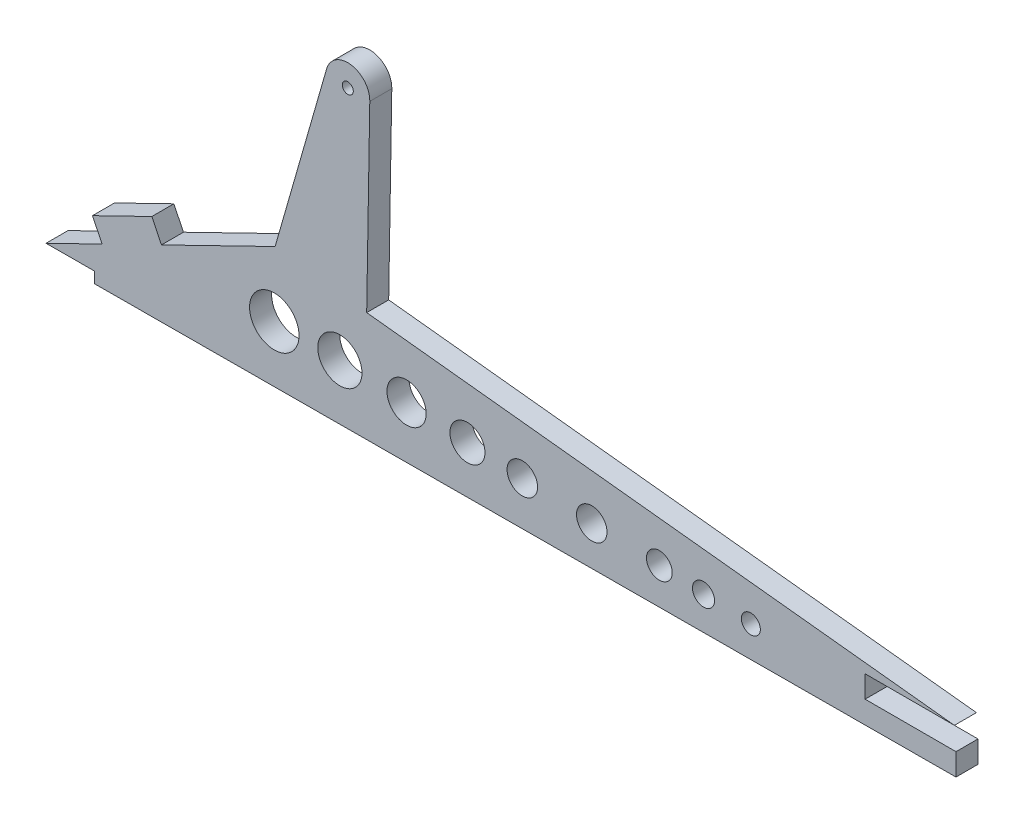
ISO-10303-21;
HEADER;
FILE_DESCRIPTION(('STEP AP214'),'2;1');
FILE_NAME('part.step','',(''),(''),'','','');
FILE_SCHEMA(('AUTOMOTIVE_DESIGN { 1 0 10303 214 1 1 1 1 }'));
ENDSEC;
DATA;
#1=APPLICATION_CONTEXT('core data for automotive mechanical design processes');
#2=APPLICATION_PROTOCOL_DEFINITION('international standard','automotive_design',2000,#1);
#3=PRODUCT_CONTEXT('',#1,'mechanical');
#4=PRODUCT('Part','Part','',(#3));
#5=PRODUCT_RELATED_PRODUCT_CATEGORY('part','',(#4));
#6=PRODUCT_DEFINITION_FORMATION('','',#4);
#7=PRODUCT_DEFINITION_CONTEXT('part definition',#1,'design');
#8=PRODUCT_DEFINITION('design','',#6,#7);
#9=PRODUCT_DEFINITION_SHAPE('','',#8);
#10=(LENGTH_UNIT() NAMED_UNIT(*) SI_UNIT(.MILLI.,.METRE.));
#11=(NAMED_UNIT(*) PLANE_ANGLE_UNIT() SI_UNIT($,.RADIAN.));
#12=(NAMED_UNIT(*) SI_UNIT($,.STERADIAN.) SOLID_ANGLE_UNIT());
#13=UNCERTAINTY_MEASURE_WITH_UNIT(LENGTH_MEASURE(1.E-05),#10,'distance_accuracy_value','');
#14=(GEOMETRIC_REPRESENTATION_CONTEXT(3) GLOBAL_UNCERTAINTY_ASSIGNED_CONTEXT((#13)) GLOBAL_UNIT_ASSIGNED_CONTEXT((#10,
#11,#12)) REPRESENTATION_CONTEXT('',''));
#15=CARTESIAN_POINT('',(0.,0.,0.));
#16=DIRECTION('',(0.,0.,1.));
#17=DIRECTION('',(1.,0.,0.));
#18=AXIS2_PLACEMENT_3D('',#15,#16,#17);
#19=CARTESIAN_POINT('',(29.3566507065568,29.7232931380651,2.));
#20=DIRECTION('',(0.,0.,1.));
#21=DIRECTION('',(1.,0.,0.));
#22=AXIS2_PLACEMENT_3D('',#19,#20,#21);
#23=PLANE('',#22);
#24=CARTESIAN_POINT('',(22.680090468022,8.02272427840867,2.));
#25=DIRECTION('',(0.,0.,1.));
#26=DIRECTION('',(1.,0.,0.));
#27=AXIS2_PLACEMENT_3D('',#24,#25,#26);
#28=CIRCLE('',#27,2.2462111920011);
#29=CARTESIAN_POINT('',(24.9263016600231,8.02272427840867,2.));
#30=VERTEX_POINT('',#29);
#31=EDGE_CURVE('E381',#30,#30,#28,.T.);
#32=ORIENTED_EDGE('',*,*,#31,.F.);
#33=EDGE_LOOP('',(#32));
#34=FACE_BOUND('',#33,.T.);
#35=CARTESIAN_POINT('',(45.2142943886309,6.94412798213639,2.));
#36=DIRECTION('',(0.,0.,1.));
#37=DIRECTION('',(1.,0.,0.));
#38=AXIS2_PLACEMENT_3D('',#35,#36,#37);
#39=CIRCLE('',#38,1.38676846513165);
#40=CARTESIAN_POINT('',(46.6010628537625,6.94412798213639,2.));
#41=VERTEX_POINT('',#40);
#42=EDGE_CURVE('E393',#41,#41,#39,.T.);
#43=ORIENTED_EDGE('',*,*,#42,.F.);
#44=EDGE_LOOP('',(#43));
#45=FACE_BOUND('',#44,.T.);
#46=CARTESIAN_POINT('',(61.6776183825757,6.04967389246499,2.));
#47=DIRECTION('',(0.,0.,1.));
#48=DIRECTION('',(1.,0.,0.));
#49=AXIS2_PLACEMENT_3D('',#46,#47,#48);
#50=CIRCLE('',#49,1.00599022067139);
#51=CARTESIAN_POINT('',(62.6836086032471,6.04967389246499,2.));
#52=VERTEX_POINT('',#51);
#53=EDGE_CURVE('E405',#52,#52,#50,.T.);
#54=ORIENTED_EDGE('',*,*,#53,.F.);
#55=EDGE_LOOP('',(#54));
#56=FACE_BOUND('',#55,.T.);
#57=CARTESIAN_POINT('',(40.2281960130975,7.26518024586645,2.));
#58=DIRECTION('',(0.,0.,1.));
#59=DIRECTION('',(1.,0.,0.));
#60=AXIS2_PLACEMENT_3D('',#57,#58,#59);
#61=CIRCLE('',#60,1.59060723683747);
#62=CARTESIAN_POINT('',(41.8188032499349,7.26518024586645,2.));
#63=VERTEX_POINT('',#62);
#64=EDGE_CURVE('E417',#63,#63,#61,.T.);
#65=ORIENTED_EDGE('',*,*,#64,.F.);
#66=EDGE_LOOP('',(#65));
#67=FACE_BOUND('',#66,.T.);
#68=CARTESIAN_POINT('',(29.3566507065568,29.7232931380651,2.));
#69=DIRECTION('',(0.,0.,1.));
#70=DIRECTION('',(1.,0.,0.));
#71=AXIS2_PLACEMENT_3D('',#68,#69,#70);
#72=CIRCLE('',#71,0.5);
#73=CARTESIAN_POINT('',(29.8566507065568,29.7232931380651,2.));
#74=VERTEX_POINT('',#73);
#75=EDGE_CURVE('E189',#74,#74,#72,.T.);
#76=ORIENTED_EDGE('',*,*,#75,.F.);
#77=EDGE_LOOP('',(#76));
#78=FACE_BOUND('',#77,.T.);
#79=CARTESIAN_POINT('',(29.3566507065568,29.7232931380651,2.));
#80=DIRECTION('',(0.,0.,1.));
#81=DIRECTION('',(1.,0.,0.));
#82=AXIS2_PLACEMENT_3D('',#79,#80,#81);
#83=CIRCLE('',#82,2.);
#84=CARTESIAN_POINT('',(31.3560328855275,29.6735849655517,2.));
#85=VERTEX_POINT('',#84);
#86=CARTESIAN_POINT('',(27.4299095256646,30.2596404339976,2.));
#87=VERTEX_POINT('',#86);
#88=EDGE_CURVE('E218',#85,#87,#83,.T.);
#89=ORIENTED_EDGE('',*,*,#88,.T.);
#90=DIRECTION('',(-0.275649217594403,-0.961258294549178,0.));
#91=VECTOR('',#90,1.);
#92=CARTESIAN_POINT('',(22.7538009631778,13.9528713412703,2.));
#93=LINE('',#92,#91);
#94=CARTESIAN_POINT('',(22.7538009631778,13.9528713412703,2.));
#95=VERTEX_POINT('',#94);
#96=EDGE_CURVE('E121',#87,#95,#93,.T.);
#97=ORIENTED_EDGE('',*,*,#96,.T.);
#98=DIRECTION('',(-0.898794046299176,-0.438371146789058,0.));
#99=VECTOR('',#98,1.);
#100=CARTESIAN_POINT('',(12.430829765545,8.91802187735826,2.));
#101=LINE('',#100,#99);
#102=CARTESIAN_POINT('',(12.430829765545,8.91802187735826,2.));
#103=VERTEX_POINT('',#102);
#104=EDGE_CURVE('E260',#95,#103,#101,.T.);
#105=ORIENTED_EDGE('',*,*,#104,.T.);
#106=DIRECTION('',(-0.438371146789109,0.898794046299152,0.));
#107=VECTOR('',#106,1.);
#108=CARTESIAN_POINT('',(11.5540874719671,10.7156099699561,2.));
#109=LINE('',#108,#107);
#110=CARTESIAN_POINT('',(11.5540874719671,10.7156099699561,2.));
#111=VERTEX_POINT('',#110);
#112=EDGE_CURVE('E279',#103,#111,#109,.T.);
#113=ORIENTED_EDGE('',*,*,#112,.T.);
#114=DIRECTION('',(-0.898794046299091,-0.438371146789234,0.));
#115=VECTOR('',#114,1.);
#116=CARTESIAN_POINT('',(6.16132319417264,8.08538308922076,2.));
#117=LINE('',#116,#115);
#118=CARTESIAN_POINT('',(6.16132319417264,8.08538308922076,2.));
#119=VERTEX_POINT('',#118);
#120=EDGE_CURVE('E276',#111,#119,#117,.T.);
#121=ORIENTED_EDGE('',*,*,#120,.T.);
#122=DIRECTION('',(0.438371146789109,-0.898794046299152,0.));
#123=VECTOR('',#122,1.);
#124=CARTESIAN_POINT('',(7.03806548775063,6.28779499662292,2.));
#125=LINE('',#124,#123);
#126=CARTESIAN_POINT('',(7.03806548775063,6.28779499662292,2.));
#127=VERTEX_POINT('',#126);
#128=EDGE_CURVE('E278',#119,#127,#125,.T.);
#129=ORIENTED_EDGE('',*,*,#128,.T.);
#130=DIRECTION('',(-0.898794046299245,-0.438371146788918,0.));
#131=VECTOR('',#130,1.);
#132=CARTESIAN_POINT('',(7.03806548775063,6.28779499662292,2.));
#133=LINE('',#132,#131);
#134=CARTESIAN_POINT('',(1.93929674249992,3.8009593180042,2.));
#135=VERTEX_POINT('',#134);
#136=EDGE_CURVE('E281',#127,#135,#133,.T.);
#137=ORIENTED_EDGE('',*,*,#136,.T.);
#138=DIRECTION('',(0.999991711061757,0.00407158541353285,0.));
#139=VECTOR('',#138,1.);
#140=CARTESIAN_POINT('',(1.93929674249992,3.8009593180042,2.));
#141=LINE('',#140,#139);
#142=CARTESIAN_POINT('',(6.36396809005763,3.8189748946526,2.));
#143=VERTEX_POINT('',#142);
#144=EDGE_CURVE('E287',#135,#143,#141,.T.);
#145=ORIENTED_EDGE('',*,*,#144,.T.);
#146=DIRECTION('',(0.00407158541473264,-0.999991711061752,0.));
#147=VECTOR('',#146,1.);
#148=CARTESIAN_POINT('',(6.36803967547237,2.81898318358677,2.));
#149=LINE('',#148,#147);
#150=CARTESIAN_POINT('',(6.36803967547237,2.81898318358677,2.));
#151=VERTEX_POINT('',#150);
#152=EDGE_CURVE('E289',#143,#151,#149,.T.);
#153=ORIENTED_EDGE('',*,*,#152,.T.);
#154=DIRECTION('',(0.999991711061761,0.00407158541259965,0.));
#155=VECTOR('',#154,1.);
#156=CARTESIAN_POINT('',(6.36803967547237,2.81898318358677,2.));
#157=LINE('',#156,#155);
#158=CARTESIAN_POINT('',(39.0801286322619,2.95217435181226,2.));
#159=VERTEX_POINT('',#158);
#160=EDGE_CURVE('E291',#151,#159,#157,.T.);
#161=ORIENTED_EDGE('',*,*,#160,.T.);
#162=DIRECTION('',(0.99999161470575,0.00409518231421341,0.));
#163=VECTOR('',#162,1.);
#164=CARTESIAN_POINT('',(39.0801286322619,2.95217435181226,2.));
#165=LINE('',#164,#163);
#166=CARTESIAN_POINT('',(84.6131730240047,3.138642033504,2.));
#167=VERTEX_POINT('',#166);
#168=EDGE_CURVE('E293',#159,#167,#165,.T.);
#169=ORIENTED_EDGE('',*,*,#168,.T.);
#170=DIRECTION('',(0.,1.,0.));
#171=VECTOR('',#170,1.);
#172=CARTESIAN_POINT('',(84.6131730240047,3.138642033504,2.));
#173=LINE('',#172,#171);
#174=CARTESIAN_POINT('',(84.6131730240047,5.13864203350491,2.));
#175=VERTEX_POINT('',#174);
#176=EDGE_CURVE('E295',#167,#175,#173,.T.);
#177=ORIENTED_EDGE('',*,*,#176,.T.);
#178=DIRECTION('',(-1.,0.,0.));
#179=VECTOR('',#178,1.);
#180=CARTESIAN_POINT('',(76.3569966280118,5.13864203350536,2.));
#181=LINE('',#180,#179);
#182=CARTESIAN_POINT('',(76.3569966280118,5.13864203350536,2.));
#183=VERTEX_POINT('',#182);
#184=EDGE_CURVE('E297',#175,#183,#181,.T.);
#185=ORIENTED_EDGE('',*,*,#184,.T.);
#186=DIRECTION('',(0.,1.,0.));
#187=VECTOR('',#186,1.);
#188=CARTESIAN_POINT('',(76.3569966280118,5.13864203350536,2.));
#189=LINE('',#188,#187);
#190=CARTESIAN_POINT('',(76.3569966280118,7.13864203350491,2.));
#191=VERTEX_POINT('',#190);
#192=EDGE_CURVE('E167',#183,#191,#189,.T.);
#193=ORIENTED_EDGE('',*,*,#192,.T.);
#194=DIRECTION('',(1.,0.,0.));
#195=VECTOR('',#194,1.);
#196=CARTESIAN_POINT('',(76.3569966280118,7.13864203350491,2.));
#197=LINE('',#196,#195);
#198=CARTESIAN_POINT('',(84.4693771304381,7.13864203350536,2.));
#199=VERTEX_POINT('',#198);
#200=EDGE_CURVE('E161',#191,#199,#197,.T.);
#201=ORIENTED_EDGE('',*,*,#200,.T.);
#202=DIRECTION('',(-0.994202761466386,0.107521482005288,0.));
#203=VECTOR('',#202,1.);
#204=CARTESIAN_POINT('',(31.0738545443462,12.9132847355992,2.));
#205=LINE('',#204,#203);
#206=CARTESIAN_POINT('',(31.0738545443462,12.9132847355992,2.));
#207=VERTEX_POINT('',#206);
#208=EDGE_CURVE('E165',#199,#207,#205,.T.);
#209=ORIENTED_EDGE('',*,*,#208,.T.);
#210=DIRECTION('',(0.0168337293134628,0.999858302739644,0.));
#211=VECTOR('',#210,1.);
#212=CARTESIAN_POINT('',(31.3560328855275,29.6735849655517,2.));
#213=LINE('',#212,#211);
#214=EDGE_CURVE('E51',#207,#85,#213,.T.);
#215=ORIENTED_EDGE('',*,*,#214,.T.);
#216=EDGE_LOOP('',(#89,#97,#105,#113,#121,#129,#137,#145,#153,#161,#169,#177,#185,#193,#201,
#209,#215));
#217=FACE_BOUND('',#216,.T.);
#218=CARTESIAN_POINT('',(34.6975794385478,7.65446375504521,2.));
#219=DIRECTION('',(0.,0.,1.));
#220=DIRECTION('',(1.,0.,0.));
#221=AXIS2_PLACEMENT_3D('',#218,#219,#220);
#222=CIRCLE('',#221,1.78299202291938);
#223=CARTESIAN_POINT('',(36.4805714614672,7.65446375504521,2.));
#224=VERTEX_POINT('',#223);
#225=EDGE_CURVE('E423',#224,#224,#222,.T.);
#226=ORIENTED_EDGE('',*,*,#225,.F.);
#227=EDGE_LOOP('',(#226));
#228=FACE_BOUND('',#227,.T.);
#229=CARTESIAN_POINT('',(57.6624037134186,6.32303913357205,2.));
#230=DIRECTION('',(0.,0.,1.));
#231=DIRECTION('',(1.,0.,0.));
#232=AXIS2_PLACEMENT_3D('',#229,#230,#231);
#233=CIRCLE('',#232,1.1683219263401);
#234=CARTESIAN_POINT('',(58.8307256397587,6.32303913357205,2.));
#235=VERTEX_POINT('',#234);
#236=EDGE_CURVE('E411',#235,#235,#233,.T.);
#237=ORIENTED_EDGE('',*,*,#236,.F.);
#238=EDGE_LOOP('',(#237));
#239=FACE_BOUND('',#238,.T.);
#240=CARTESIAN_POINT('',(65.9754176598451,5.87047321346441,2.));
#241=DIRECTION('',(0.,0.,1.));
#242=DIRECTION('',(1.,0.,0.));
#243=AXIS2_PLACEMENT_3D('',#240,#241,#242);
#244=CIRCLE('',#243,0.862372677728845);
#245=CARTESIAN_POINT('',(66.837790337574,5.87047321346441,2.));
#246=VERTEX_POINT('',#245);
#247=EDGE_CURVE('E399',#246,#246,#244,.T.);
#248=ORIENTED_EDGE('',*,*,#247,.F.);
#249=EDGE_LOOP('',(#248));
#250=FACE_BOUND('',#249,.T.);
#251=CARTESIAN_POINT('',(28.6361522127461,7.94352555744459,2.));
#252=DIRECTION('',(0.,0.,1.));
#253=DIRECTION('',(1.,0.,0.));
#254=AXIS2_PLACEMENT_3D('',#251,#252,#253);
#255=CIRCLE('',#254,2.00769198162189);
#256=CARTESIAN_POINT('',(30.643844194368,7.94352555744459,2.));
#257=VERTEX_POINT('',#256);
#258=EDGE_CURVE('E387',#257,#257,#255,.T.);
#259=ORIENTED_EDGE('',*,*,#258,.F.);
#260=EDGE_LOOP('',(#259));
#261=FACE_BOUND('',#260,.T.);
#262=CARTESIAN_POINT('',(51.5237527321467,6.55690835698775,2.));
#263=DIRECTION('',(0.,0.,1.));
#264=DIRECTION('',(1.,0.,0.));
#265=AXIS2_PLACEMENT_3D('',#262,#263,#264);
#266=CIRCLE('',#265,1.38676846513165);
#267=CARTESIAN_POINT('',(52.9105211972784,6.55690835698775,2.));
#268=VERTEX_POINT('',#267);
#269=EDGE_CURVE('E372',#268,#268,#266,.T.);
#270=ORIENTED_EDGE('',*,*,#269,.F.);
#271=EDGE_LOOP('',(#270));
#272=FACE_BOUND('',#271,.T.);
#273=ADVANCED_FACE('F34',(#34,#45,#56,#67,#78,#217,#228,#239,#250,#261,#272),#23,.T.);
#274=CARTESIAN_POINT('',(29.3566507065568,29.7232931380651,0.));
#275=DIRECTION('',(0.,0.,1.));
#276=DIRECTION('',(1.,0.,0.));
#277=AXIS2_PLACEMENT_3D('',#274,#275,#276);
#278=PLANE('',#277);
#279=CARTESIAN_POINT('',(29.3566507065568,29.7232931380651,0.));
#280=DIRECTION('',(0.,0.,1.));
#281=DIRECTION('',(1.,0.,0.));
#282=AXIS2_PLACEMENT_3D('',#279,#280,#281);
#283=CIRCLE('',#282,2.);
#284=CARTESIAN_POINT('',(31.3560328855275,29.6735849655517,0.));
#285=VERTEX_POINT('',#284);
#286=CARTESIAN_POINT('',(27.4299095256646,30.2596404339976,0.));
#287=VERTEX_POINT('',#286);
#288=EDGE_CURVE('E185',#285,#287,#283,.T.);
#289=ORIENTED_EDGE('',*,*,#288,.F.);
#290=DIRECTION('',(0.0168337293134628,0.999858302739644,0.));
#291=VECTOR('',#290,1.);
#292=CARTESIAN_POINT('',(31.3560328855275,29.6735849655517,0.));
#293=LINE('',#292,#291);
#294=CARTESIAN_POINT('',(31.0738545443462,12.9132847355992,0.));
#295=VERTEX_POINT('',#294);
#296=EDGE_CURVE('E113',#295,#285,#293,.T.);
#297=ORIENTED_EDGE('',*,*,#296,.F.);
#298=DIRECTION('',(-0.994202761466386,0.107521482005288,0.));
#299=VECTOR('',#298,1.);
#300=CARTESIAN_POINT('',(31.0738545443462,12.9132847355992,0.));
#301=LINE('',#300,#299);
#302=CARTESIAN_POINT('',(84.4693771304381,7.13864203350536,0.));
#303=VERTEX_POINT('',#302);
#304=EDGE_CURVE('E107',#303,#295,#301,.T.);
#305=ORIENTED_EDGE('',*,*,#304,.F.);
#306=DIRECTION('',(1.,0.,0.));
#307=VECTOR('',#306,1.);
#308=CARTESIAN_POINT('',(76.3569966280118,7.13864203350491,0.));
#309=LINE('',#308,#307);
#310=CARTESIAN_POINT('',(76.3569966280118,7.13864203350491,0.));
#311=VERTEX_POINT('',#310);
#312=EDGE_CURVE('E175',#311,#303,#309,.T.);
#313=ORIENTED_EDGE('',*,*,#312,.F.);
#314=DIRECTION('',(0.,1.,0.));
#315=VECTOR('',#314,1.);
#316=CARTESIAN_POINT('',(76.3569966280118,5.13864203350536,0.));
#317=LINE('',#316,#315);
#318=CARTESIAN_POINT('',(76.3569966280118,5.13864203350536,0.));
#319=VERTEX_POINT('',#318);
#320=EDGE_CURVE('E213',#319,#311,#317,.T.);
#321=ORIENTED_EDGE('',*,*,#320,.F.);
#322=DIRECTION('',(-1.,0.,0.));
#323=VECTOR('',#322,1.);
#324=CARTESIAN_POINT('',(76.3569966280118,5.13864203350536,0.));
#325=LINE('',#324,#323);
#326=CARTESIAN_POINT('',(84.6131730240047,5.13864203350491,0.));
#327=VERTEX_POINT('',#326);
#328=EDGE_CURVE('E211',#327,#319,#325,.T.);
#329=ORIENTED_EDGE('',*,*,#328,.F.);
#330=DIRECTION('',(0.,1.,0.));
#331=VECTOR('',#330,1.);
#332=CARTESIAN_POINT('',(84.6131730240047,3.138642033504,0.));
#333=LINE('',#332,#331);
#334=CARTESIAN_POINT('',(84.6131730240047,3.138642033504,0.));
#335=VERTEX_POINT('',#334);
#336=EDGE_CURVE('E209',#335,#327,#333,.T.);
#337=ORIENTED_EDGE('',*,*,#336,.F.);
#338=DIRECTION('',(0.99999161470575,0.00409518231421341,0.));
#339=VECTOR('',#338,1.);
#340=CARTESIAN_POINT('',(39.0801286322619,2.95217435181226,0.));
#341=LINE('',#340,#339);
#342=CARTESIAN_POINT('',(39.0801286322619,2.95217435181226,0.));
#343=VERTEX_POINT('',#342);
#344=EDGE_CURVE('E207',#343,#335,#341,.T.);
#345=ORIENTED_EDGE('',*,*,#344,.F.);
#346=DIRECTION('',(0.999991711061761,0.00407158541259965,0.));
#347=VECTOR('',#346,1.);
#348=CARTESIAN_POINT('',(6.36803967547237,2.81898318358677,0.));
#349=LINE('',#348,#347);
#350=CARTESIAN_POINT('',(6.36803967547237,2.81898318358677,0.));
#351=VERTEX_POINT('',#350);
#352=EDGE_CURVE('E205',#351,#343,#349,.T.);
#353=ORIENTED_EDGE('',*,*,#352,.F.);
#354=DIRECTION('',(0.00407158541473264,-0.999991711061752,0.));
#355=VECTOR('',#354,1.);
#356=CARTESIAN_POINT('',(6.36803967547237,2.81898318358677,0.));
#357=LINE('',#356,#355);
#358=CARTESIAN_POINT('',(6.36396809005763,3.8189748946526,0.));
#359=VERTEX_POINT('',#358);
#360=EDGE_CURVE('E203',#359,#351,#357,.T.);
#361=ORIENTED_EDGE('',*,*,#360,.F.);
#362=DIRECTION('',(0.999991711061757,0.00407158541353285,0.));
#363=VECTOR('',#362,1.);
#364=CARTESIAN_POINT('',(1.93929674249992,3.8009593180042,0.));
#365=LINE('',#364,#363);
#366=CARTESIAN_POINT('',(1.93929674249992,3.8009593180042,0.));
#367=VERTEX_POINT('',#366);
#368=EDGE_CURVE('E201',#367,#359,#365,.T.);
#369=ORIENTED_EDGE('',*,*,#368,.F.);
#370=DIRECTION('',(-0.898794046299245,-0.438371146788918,0.));
#371=VECTOR('',#370,1.);
#372=CARTESIAN_POINT('',(7.03806548775063,6.28779499662292,0.));
#373=LINE('',#372,#371);
#374=CARTESIAN_POINT('',(7.03806548775063,6.28779499662292,0.));
#375=VERTEX_POINT('',#374);
#376=EDGE_CURVE('E199',#375,#367,#373,.T.);
#377=ORIENTED_EDGE('',*,*,#376,.F.);
#378=DIRECTION('',(0.438371146789109,-0.898794046299152,0.));
#379=VECTOR('',#378,1.);
#380=CARTESIAN_POINT('',(7.03806548775063,6.28779499662292,0.));
#381=LINE('',#380,#379);
#382=CARTESIAN_POINT('',(6.16132319417264,8.08538308922076,0.));
#383=VERTEX_POINT('',#382);
#384=EDGE_CURVE('E197',#383,#375,#381,.T.);
#385=ORIENTED_EDGE('',*,*,#384,.F.);
#386=DIRECTION('',(-0.898794046299091,-0.438371146789234,0.));
#387=VECTOR('',#386,1.);
#388=CARTESIAN_POINT('',(6.16132319417264,8.08538308922076,0.));
#389=LINE('',#388,#387);
#390=CARTESIAN_POINT('',(11.5540874719671,10.7156099699561,0.));
#391=VERTEX_POINT('',#390);
#392=EDGE_CURVE('E195',#391,#383,#389,.T.);
#393=ORIENTED_EDGE('',*,*,#392,.F.);
#394=DIRECTION('',(-0.438371146789109,0.898794046299152,0.));
#395=VECTOR('',#394,1.);
#396=CARTESIAN_POINT('',(11.5540874719671,10.7156099699561,0.));
#397=LINE('',#396,#395);
#398=CARTESIAN_POINT('',(12.430829765545,8.91802187735826,0.));
#399=VERTEX_POINT('',#398);
#400=EDGE_CURVE('E193',#399,#391,#397,.T.);
#401=ORIENTED_EDGE('',*,*,#400,.F.);
#402=DIRECTION('',(-0.898794046299176,-0.438371146789058,0.));
#403=VECTOR('',#402,1.);
#404=CARTESIAN_POINT('',(12.430829765545,8.91802187735826,0.));
#405=LINE('',#404,#403);
#406=CARTESIAN_POINT('',(22.7538009631778,13.9528713412703,0.));
#407=VERTEX_POINT('',#406);
#408=EDGE_CURVE('E191',#407,#399,#405,.T.);
#409=ORIENTED_EDGE('',*,*,#408,.F.);
#410=DIRECTION('',(-0.275649217594403,-0.961258294549178,0.));
#411=VECTOR('',#410,1.);
#412=CARTESIAN_POINT('',(22.7538009631778,13.9528713412703,0.));
#413=LINE('',#412,#411);
#414=EDGE_CURVE('E188',#287,#407,#413,.T.);
#415=ORIENTED_EDGE('',*,*,#414,.F.);
#416=EDGE_LOOP('',(#289,#297,#305,#313,#321,#329,#337,#345,#353,#361,#369,#377,#385,#393,#401,
#409,#415));
#417=FACE_BOUND('',#416,.T.);
#418=CARTESIAN_POINT('',(29.3566507065568,29.7232931380651,0.));
#419=DIRECTION('',(0.,0.,1.));
#420=DIRECTION('',(1.,0.,0.));
#421=AXIS2_PLACEMENT_3D('',#418,#419,#420);
#422=CIRCLE('',#421,0.5);
#423=CARTESIAN_POINT('',(29.8566507065568,29.7232931380651,0.));
#424=VERTEX_POINT('',#423);
#425=EDGE_CURVE('E426',#424,#424,#422,.T.);
#426=ORIENTED_EDGE('',*,*,#425,.T.);
#427=EDGE_LOOP('',(#426));
#428=FACE_BOUND('',#427,.T.);
#429=CARTESIAN_POINT('',(34.6975794385478,7.65446375504521,0.));
#430=DIRECTION('',(0.,0.,1.));
#431=DIRECTION('',(1.,0.,0.));
#432=AXIS2_PLACEMENT_3D('',#429,#430,#431);
#433=CIRCLE('',#432,1.78299202291938);
#434=CARTESIAN_POINT('',(36.4805714614672,7.65446375504521,0.));
#435=VERTEX_POINT('',#434);
#436=EDGE_CURVE('E420',#435,#435,#433,.T.);
#437=ORIENTED_EDGE('',*,*,#436,.T.);
#438=EDGE_LOOP('',(#437));
#439=FACE_BOUND('',#438,.T.);
#440=CARTESIAN_POINT('',(40.2281960130975,7.26518024586645,0.));
#441=DIRECTION('',(0.,0.,1.));
#442=DIRECTION('',(1.,0.,0.));
#443=AXIS2_PLACEMENT_3D('',#440,#441,#442);
#444=CIRCLE('',#443,1.59060723683747);
#445=CARTESIAN_POINT('',(41.8188032499349,7.26518024586645,0.));
#446=VERTEX_POINT('',#445);
#447=EDGE_CURVE('E414',#446,#446,#444,.T.);
#448=ORIENTED_EDGE('',*,*,#447,.T.);
#449=EDGE_LOOP('',(#448));
#450=FACE_BOUND('',#449,.T.);
#451=CARTESIAN_POINT('',(57.6624037134186,6.32303913357205,0.));
#452=DIRECTION('',(0.,0.,1.));
#453=DIRECTION('',(1.,0.,0.));
#454=AXIS2_PLACEMENT_3D('',#451,#452,#453);
#455=CIRCLE('',#454,1.1683219263401);
#456=CARTESIAN_POINT('',(58.8307256397587,6.32303913357205,0.));
#457=VERTEX_POINT('',#456);
#458=EDGE_CURVE('E408',#457,#457,#455,.T.);
#459=ORIENTED_EDGE('',*,*,#458,.T.);
#460=EDGE_LOOP('',(#459));
#461=FACE_BOUND('',#460,.T.);
#462=CARTESIAN_POINT('',(61.6776183825757,6.04967389246499,0.));
#463=DIRECTION('',(0.,0.,1.));
#464=DIRECTION('',(1.,0.,0.));
#465=AXIS2_PLACEMENT_3D('',#462,#463,#464);
#466=CIRCLE('',#465,1.00599022067139);
#467=CARTESIAN_POINT('',(62.6836086032471,6.04967389246499,0.));
#468=VERTEX_POINT('',#467);
#469=EDGE_CURVE('E402',#468,#468,#466,.T.);
#470=ORIENTED_EDGE('',*,*,#469,.T.);
#471=EDGE_LOOP('',(#470));
#472=FACE_BOUND('',#471,.T.);
#473=CARTESIAN_POINT('',(65.9754176598451,5.87047321346441,0.));
#474=DIRECTION('',(0.,0.,1.));
#475=DIRECTION('',(1.,0.,0.));
#476=AXIS2_PLACEMENT_3D('',#473,#474,#475);
#477=CIRCLE('',#476,0.862372677728845);
#478=CARTESIAN_POINT('',(66.837790337574,5.87047321346441,0.));
#479=VERTEX_POINT('',#478);
#480=EDGE_CURVE('E396',#479,#479,#477,.T.);
#481=ORIENTED_EDGE('',*,*,#480,.T.);
#482=EDGE_LOOP('',(#481));
#483=FACE_BOUND('',#482,.T.);
#484=CARTESIAN_POINT('',(45.2142943886309,6.94412798213639,0.));
#485=DIRECTION('',(0.,0.,1.));
#486=DIRECTION('',(1.,0.,0.));
#487=AXIS2_PLACEMENT_3D('',#484,#485,#486);
#488=CIRCLE('',#487,1.38676846513165);
#489=CARTESIAN_POINT('',(46.6010628537625,6.94412798213639,0.));
#490=VERTEX_POINT('',#489);
#491=EDGE_CURVE('E390',#490,#490,#488,.T.);
#492=ORIENTED_EDGE('',*,*,#491,.T.);
#493=EDGE_LOOP('',(#492));
#494=FACE_BOUND('',#493,.T.);
#495=CARTESIAN_POINT('',(28.6361522127461,7.94352555744459,0.));
#496=DIRECTION('',(0.,0.,1.));
#497=DIRECTION('',(1.,0.,0.));
#498=AXIS2_PLACEMENT_3D('',#495,#496,#497);
#499=CIRCLE('',#498,2.00769198162189);
#500=CARTESIAN_POINT('',(30.643844194368,7.94352555744459,0.));
#501=VERTEX_POINT('',#500);
#502=EDGE_CURVE('E384',#501,#501,#499,.T.);
#503=ORIENTED_EDGE('',*,*,#502,.T.);
#504=EDGE_LOOP('',(#503));
#505=FACE_BOUND('',#504,.T.);
#506=CARTESIAN_POINT('',(22.680090468022,8.02272427840867,0.));
#507=DIRECTION('',(0.,0.,1.));
#508=DIRECTION('',(1.,0.,0.));
#509=AXIS2_PLACEMENT_3D('',#506,#507,#508);
#510=CIRCLE('',#509,2.2462111920011);
#511=CARTESIAN_POINT('',(24.9263016600231,8.02272427840867,0.));
#512=VERTEX_POINT('',#511);
#513=EDGE_CURVE('E378',#512,#512,#510,.T.);
#514=ORIENTED_EDGE('',*,*,#513,.T.);
#515=EDGE_LOOP('',(#514));
#516=FACE_BOUND('',#515,.T.);
#517=CARTESIAN_POINT('',(51.5237527321467,6.55690835698775,0.));
#518=DIRECTION('',(0.,0.,1.));
#519=DIRECTION('',(1.,0.,0.));
#520=AXIS2_PLACEMENT_3D('',#517,#518,#519);
#521=CIRCLE('',#520,1.38676846513165);
#522=CARTESIAN_POINT('',(52.9105211972784,6.55690835698775,0.));
#523=VERTEX_POINT('',#522);
#524=EDGE_CURVE('E375',#523,#523,#521,.T.);
#525=ORIENTED_EDGE('',*,*,#524,.T.);
#526=EDGE_LOOP('',(#525));
#527=FACE_BOUND('',#526,.T.);
#528=ADVANCED_FACE('F264',(#417,#428,#439,#450,#461,#472,#483,#494,#505,#516,#527),#278,.F.);
#529=CARTESIAN_POINT('',(29.3566507065568,29.7232931380651,2.));
#530=DIRECTION('',(0.,0.,-1.));
#531=DIRECTION('',(-1.,0.,0.));
#532=AXIS2_PLACEMENT_3D('',#529,#530,#531);
#533=CYLINDRICAL_SURFACE('',#532,2.);
#534=ORIENTED_EDGE('',*,*,#288,.T.);
#535=DIRECTION('',(0.,0.,-1.));
#536=VECTOR('',#535,1.);
#537=CARTESIAN_POINT('',(27.4299095256646,30.2596404339976,2.));
#538=LINE('',#537,#536);
#539=EDGE_CURVE('E11',#87,#287,#538,.T.);
#540=ORIENTED_EDGE('',*,*,#539,.F.);
#541=ORIENTED_EDGE('',*,*,#88,.F.);
#542=DIRECTION('',(0.,0.,-1.));
#543=VECTOR('',#542,1.);
#544=CARTESIAN_POINT('',(31.3560328855275,29.6735849655517,2.));
#545=LINE('',#544,#543);
#546=EDGE_CURVE('E181',#85,#285,#545,.T.);
#547=ORIENTED_EDGE('',*,*,#546,.T.);
#548=EDGE_LOOP('',(#534,#540,#541,#547));
#549=FACE_BOUND('',#548,.T.);
#550=ADVANCED_FACE('F36',(#549),#533,.T.);
#551=CARTESIAN_POINT('',(22.7538009631778,13.9528713412703,2.));
#552=DIRECTION('',(0.961258294549178,-0.275649217594403,0.));
#553=DIRECTION('',(0.275649217594403,0.961258294549178,0.));
#554=AXIS2_PLACEMENT_3D('',#551,#552,#553);
#555=PLANE('',#554);
#556=ORIENTED_EDGE('',*,*,#414,.T.);
#557=DIRECTION('',(0.,0.,-1.));
#558=VECTOR('',#557,1.);
#559=CARTESIAN_POINT('',(22.7538009631778,13.9528713412703,2.));
#560=LINE('',#559,#558);
#561=EDGE_CURVE('E43',#95,#407,#560,.T.);
#562=ORIENTED_EDGE('',*,*,#561,.F.);
#563=ORIENTED_EDGE('',*,*,#96,.F.);
#564=ORIENTED_EDGE('',*,*,#539,.T.);
#565=EDGE_LOOP('',(#556,#562,#563,#564));
#566=FACE_BOUND('',#565,.T.);
#567=ADVANCED_FACE('F640',(#566),#555,.F.);
#568=CARTESIAN_POINT('',(12.430829765545,8.91802187735826,2.));
#569=DIRECTION('',(0.438371146789058,-0.898794046299177,0.));
#570=DIRECTION('',(0.898794046299177,0.438371146789058,0.));
#571=AXIS2_PLACEMENT_3D('',#568,#569,#570);
#572=PLANE('',#571);
#573=ORIENTED_EDGE('',*,*,#408,.T.);
#574=DIRECTION('',(0.,0.,-1.));
#575=VECTOR('',#574,1.);
#576=CARTESIAN_POINT('',(12.430829765545,8.91802187735826,2.));
#577=LINE('',#576,#575);
#578=EDGE_CURVE('E252',#103,#399,#577,.T.);
#579=ORIENTED_EDGE('',*,*,#578,.F.);
#580=ORIENTED_EDGE('',*,*,#104,.F.);
#581=ORIENTED_EDGE('',*,*,#561,.T.);
#582=EDGE_LOOP('',(#573,#579,#580,#581));
#583=FACE_BOUND('',#582,.T.);
#584=ADVANCED_FACE('F258',(#583),#572,.F.);
#585=CARTESIAN_POINT('',(11.5540874719671,10.7156099699561,2.));
#586=DIRECTION('',(-0.898794046299152,-0.438371146789109,0.));
#587=DIRECTION('',(0.438371146789109,-0.898794046299152,0.));
#588=AXIS2_PLACEMENT_3D('',#585,#586,#587);
#589=PLANE('',#588);
#590=ORIENTED_EDGE('',*,*,#400,.T.);
#591=DIRECTION('',(0.,0.,-1.));
#592=VECTOR('',#591,1.);
#593=CARTESIAN_POINT('',(11.5540874719671,10.7156099699561,2.));
#594=LINE('',#593,#592);
#595=EDGE_CURVE('E249',#111,#391,#594,.T.);
#596=ORIENTED_EDGE('',*,*,#595,.F.);
#597=ORIENTED_EDGE('',*,*,#112,.F.);
#598=ORIENTED_EDGE('',*,*,#578,.T.);
#599=EDGE_LOOP('',(#590,#596,#597,#598));
#600=FACE_BOUND('',#599,.T.);
#601=ADVANCED_FACE('F270',(#600),#589,.F.);
#602=CARTESIAN_POINT('',(6.16132319417264,8.08538308922076,2.));
#603=DIRECTION('',(0.438371146789234,-0.898794046299091,0.));
#604=DIRECTION('',(0.898794046299091,0.438371146789234,0.));
#605=AXIS2_PLACEMENT_3D('',#602,#603,#604);
#606=PLANE('',#605);
#607=ORIENTED_EDGE('',*,*,#392,.T.);
#608=DIRECTION('',(0.,0.,-1.));
#609=VECTOR('',#608,1.);
#610=CARTESIAN_POINT('',(6.16132319417264,8.08538308922076,2.));
#611=LINE('',#610,#609);
#612=EDGE_CURVE('E246',#119,#383,#611,.T.);
#613=ORIENTED_EDGE('',*,*,#612,.F.);
#614=ORIENTED_EDGE('',*,*,#120,.F.);
#615=ORIENTED_EDGE('',*,*,#595,.T.);
#616=EDGE_LOOP('',(#607,#613,#614,#615));
#617=FACE_BOUND('',#616,.T.);
#618=ADVANCED_FACE('F274',(#617),#606,.F.);
#619=CARTESIAN_POINT('',(7.03806548775063,6.28779499662292,2.));
#620=DIRECTION('',(0.898794046299152,0.438371146789109,0.));
#621=DIRECTION('',(-0.438371146789109,0.898794046299152,0.));
#622=AXIS2_PLACEMENT_3D('',#619,#620,#621);
#623=PLANE('',#622);
#624=ORIENTED_EDGE('',*,*,#384,.T.);
#625=DIRECTION('',(0.,0.,-1.));
#626=VECTOR('',#625,1.);
#627=CARTESIAN_POINT('',(7.03806548775063,6.28779499662292,2.));
#628=LINE('',#627,#626);
#629=EDGE_CURVE('E243',#127,#375,#628,.T.);
#630=ORIENTED_EDGE('',*,*,#629,.F.);
#631=ORIENTED_EDGE('',*,*,#128,.F.);
#632=ORIENTED_EDGE('',*,*,#612,.T.);
#633=EDGE_LOOP('',(#624,#630,#631,#632));
#634=FACE_BOUND('',#633,.T.);
#635=ADVANCED_FACE('F605',(#634),#623,.F.);
#636=CARTESIAN_POINT('',(7.03806548775063,6.28779499662292,2.));
#637=DIRECTION('',(0.438371146788918,-0.898794046299245,0.));
#638=DIRECTION('',(0.898794046299245,0.438371146788918,0.));
#639=AXIS2_PLACEMENT_3D('',#636,#637,#638);
#640=PLANE('',#639);
#641=ORIENTED_EDGE('',*,*,#376,.T.);
#642=DIRECTION('',(0.,0.,-1.));
#643=VECTOR('',#642,1.);
#644=CARTESIAN_POINT('',(1.93929674249992,3.8009593180042,2.));
#645=LINE('',#644,#643);
#646=EDGE_CURVE('E240',#135,#367,#645,.T.);
#647=ORIENTED_EDGE('',*,*,#646,.F.);
#648=ORIENTED_EDGE('',*,*,#136,.F.);
#649=ORIENTED_EDGE('',*,*,#629,.T.);
#650=EDGE_LOOP('',(#641,#647,#648,#649));
#651=FACE_BOUND('',#650,.T.);
#652=ADVANCED_FACE('F595',(#651),#640,.F.);
#653=CARTESIAN_POINT('',(1.93929674249992,3.8009593180042,2.));
#654=DIRECTION('',(-0.00407158541353285,0.999991711061757,0.));
#655=DIRECTION('',(-0.999991711061757,-0.00407158541353285,0.));
#656=AXIS2_PLACEMENT_3D('',#653,#654,#655);
#657=PLANE('',#656);
#658=ORIENTED_EDGE('',*,*,#368,.T.);
#659=DIRECTION('',(0.,0.,-1.));
#660=VECTOR('',#659,1.);
#661=CARTESIAN_POINT('',(6.36396809005763,3.8189748946526,2.));
#662=LINE('',#661,#660);
#663=EDGE_CURVE('E237',#143,#359,#662,.T.);
#664=ORIENTED_EDGE('',*,*,#663,.F.);
#665=ORIENTED_EDGE('',*,*,#144,.F.);
#666=ORIENTED_EDGE('',*,*,#646,.T.);
#667=EDGE_LOOP('',(#658,#664,#665,#666));
#668=FACE_BOUND('',#667,.T.);
#669=ADVANCED_FACE('F585',(#668),#657,.F.);
#670=CARTESIAN_POINT('',(6.36803967547237,2.81898318358677,2.));
#671=DIRECTION('',(0.999991711061752,0.00407158541473264,0.));
#672=DIRECTION('',(-0.00407158541473264,0.999991711061752,0.));
#673=AXIS2_PLACEMENT_3D('',#670,#671,#672);
#674=PLANE('',#673);
#675=ORIENTED_EDGE('',*,*,#360,.T.);
#676=DIRECTION('',(0.,0.,-1.));
#677=VECTOR('',#676,1.);
#678=CARTESIAN_POINT('',(6.36803967547237,2.81898318358677,2.));
#679=LINE('',#678,#677);
#680=EDGE_CURVE('E234',#151,#351,#679,.T.);
#681=ORIENTED_EDGE('',*,*,#680,.F.);
#682=ORIENTED_EDGE('',*,*,#152,.F.);
#683=ORIENTED_EDGE('',*,*,#663,.T.);
#684=EDGE_LOOP('',(#675,#681,#682,#683));
#685=FACE_BOUND('',#684,.T.);
#686=ADVANCED_FACE('F575',(#685),#674,.F.);
#687=CARTESIAN_POINT('',(6.36803967547237,2.81898318358677,2.));
#688=DIRECTION('',(-0.00407158541259965,0.999991711061761,0.));
#689=DIRECTION('',(-0.999991711061761,-0.00407158541259965,0.));
#690=AXIS2_PLACEMENT_3D('',#687,#688,#689);
#691=PLANE('',#690);
#692=ORIENTED_EDGE('',*,*,#352,.T.);
#693=DIRECTION('',(0.,0.,-1.));
#694=VECTOR('',#693,1.);
#695=CARTESIAN_POINT('',(39.0801286322619,2.95217435181226,2.));
#696=LINE('',#695,#694);
#697=EDGE_CURVE('E231',#159,#343,#696,.T.);
#698=ORIENTED_EDGE('',*,*,#697,.F.);
#699=ORIENTED_EDGE('',*,*,#160,.F.);
#700=ORIENTED_EDGE('',*,*,#680,.T.);
#701=EDGE_LOOP('',(#692,#698,#699,#700));
#702=FACE_BOUND('',#701,.T.);
#703=ADVANCED_FACE('F565',(#702),#691,.F.);
#704=CARTESIAN_POINT('',(39.0801286322619,2.95217435181226,2.));
#705=DIRECTION('',(-0.00409518231421341,0.99999161470575,0.));
#706=DIRECTION('',(-0.99999161470575,-0.00409518231421341,0.));
#707=AXIS2_PLACEMENT_3D('',#704,#705,#706);
#708=PLANE('',#707);
#709=ORIENTED_EDGE('',*,*,#344,.T.);
#710=DIRECTION('',(0.,0.,-1.));
#711=VECTOR('',#710,1.);
#712=CARTESIAN_POINT('',(84.6131730240047,3.138642033504,2.));
#713=LINE('',#712,#711);
#714=EDGE_CURVE('E228',#167,#335,#713,.T.);
#715=ORIENTED_EDGE('',*,*,#714,.F.);
#716=ORIENTED_EDGE('',*,*,#168,.F.);
#717=ORIENTED_EDGE('',*,*,#697,.T.);
#718=EDGE_LOOP('',(#709,#715,#716,#717));
#719=FACE_BOUND('',#718,.T.);
#720=ADVANCED_FACE('F555',(#719),#708,.F.);
#721=CARTESIAN_POINT('',(84.6131730240047,3.138642033504,2.));
#722=DIRECTION('',(-1.,0.,0.));
#723=DIRECTION('',(0.,0.,1.));
#724=AXIS2_PLACEMENT_3D('',#721,#722,#723);
#725=PLANE('',#724);
#726=ORIENTED_EDGE('',*,*,#336,.T.);
#727=DIRECTION('',(0.,0.,-1.));
#728=VECTOR('',#727,1.);
#729=CARTESIAN_POINT('',(84.6131730240047,5.13864203350491,2.));
#730=LINE('',#729,#728);
#731=EDGE_CURVE('E225',#175,#327,#730,.T.);
#732=ORIENTED_EDGE('',*,*,#731,.F.);
#733=ORIENTED_EDGE('',*,*,#176,.F.);
#734=ORIENTED_EDGE('',*,*,#714,.T.);
#735=EDGE_LOOP('',(#726,#732,#733,#734));
#736=FACE_BOUND('',#735,.T.);
#737=ADVANCED_FACE('F546',(#736),#725,.F.);
#738=CARTESIAN_POINT('',(76.3569966280118,5.13864203350536,2.));
#739=DIRECTION('',(0.,-1.,0.));
#740=DIRECTION('',(1.,0.,0.));
#741=AXIS2_PLACEMENT_3D('',#738,#739,#740);
#742=PLANE('',#741);
#743=ORIENTED_EDGE('',*,*,#328,.T.);
#744=DIRECTION('',(0.,0.,-1.));
#745=VECTOR('',#744,1.);
#746=CARTESIAN_POINT('',(76.3569966280118,5.13864203350536,2.));
#747=LINE('',#746,#745);
#748=EDGE_CURVE('E222',#183,#319,#747,.T.);
#749=ORIENTED_EDGE('',*,*,#748,.F.);
#750=ORIENTED_EDGE('',*,*,#184,.F.);
#751=ORIENTED_EDGE('',*,*,#731,.T.);
#752=EDGE_LOOP('',(#743,#749,#750,#751));
#753=FACE_BOUND('',#752,.T.);
#754=ADVANCED_FACE('F303',(#753),#742,.F.);
#755=CARTESIAN_POINT('',(76.3569966280118,5.13864203350536,2.));
#756=DIRECTION('',(-1.,0.,0.));
#757=DIRECTION('',(0.,0.,1.));
#758=AXIS2_PLACEMENT_3D('',#755,#756,#757);
#759=PLANE('',#758);
#760=ORIENTED_EDGE('',*,*,#320,.T.);
#761=DIRECTION('',(0.,0.,-1.));
#762=VECTOR('',#761,1.);
#763=CARTESIAN_POINT('',(76.3569966280118,7.13864203350491,2.));
#764=LINE('',#763,#762);
#765=EDGE_CURVE('E176',#191,#311,#764,.T.);
#766=ORIENTED_EDGE('',*,*,#765,.F.);
#767=ORIENTED_EDGE('',*,*,#192,.F.);
#768=ORIENTED_EDGE('',*,*,#748,.T.);
#769=EDGE_LOOP('',(#760,#766,#767,#768));
#770=FACE_BOUND('',#769,.T.);
#771=ADVANCED_FACE('F307',(#770),#759,.F.);
#772=CARTESIAN_POINT('',(76.3569966280118,7.13864203350491,2.));
#773=DIRECTION('',(0.,1.,0.));
#774=DIRECTION('',(-1.,0.,0.));
#775=AXIS2_PLACEMENT_3D('',#772,#773,#774);
#776=PLANE('',#775);
#777=ORIENTED_EDGE('',*,*,#312,.T.);
#778=DIRECTION('',(0.,0.,-1.));
#779=VECTOR('',#778,1.);
#780=CARTESIAN_POINT('',(84.4693771304381,7.13864203350536,2.));
#781=LINE('',#780,#779);
#782=EDGE_CURVE('E172',#199,#303,#781,.T.);
#783=ORIENTED_EDGE('',*,*,#782,.F.);
#784=ORIENTED_EDGE('',*,*,#200,.F.);
#785=ORIENTED_EDGE('',*,*,#765,.T.);
#786=EDGE_LOOP('',(#777,#783,#784,#785));
#787=FACE_BOUND('',#786,.T.);
#788=ADVANCED_FACE('F173',(#787),#776,.F.);
#789=CARTESIAN_POINT('',(31.0738545443462,12.9132847355992,2.));
#790=DIRECTION('',(-0.107521482005288,-0.994202761466386,0.));
#791=DIRECTION('',(0.994202761466386,-0.107521482005288,0.));
#792=AXIS2_PLACEMENT_3D('',#789,#790,#791);
#793=PLANE('',#792);
#794=ORIENTED_EDGE('',*,*,#304,.T.);
#795=DIRECTION('',(0.,0.,-1.));
#796=VECTOR('',#795,1.);
#797=CARTESIAN_POINT('',(31.0738545443462,12.9132847355992,2.));
#798=LINE('',#797,#796);
#799=EDGE_CURVE('E177',#207,#295,#798,.T.);
#800=ORIENTED_EDGE('',*,*,#799,.F.);
#801=ORIENTED_EDGE('',*,*,#208,.F.);
#802=ORIENTED_EDGE('',*,*,#782,.T.);
#803=EDGE_LOOP('',(#794,#800,#801,#802));
#804=FACE_BOUND('',#803,.T.);
#805=ADVANCED_FACE('F179',(#804),#793,.F.);
#806=CARTESIAN_POINT('',(31.3560328855275,29.6735849655517,2.));
#807=DIRECTION('',(-0.999858302739644,0.0168337293134628,0.));
#808=DIRECTION('',(-0.0168337293134628,-0.999858302739644,0.));
#809=AXIS2_PLACEMENT_3D('',#806,#807,#808);
#810=PLANE('',#809);
#811=ORIENTED_EDGE('',*,*,#296,.T.);
#812=ORIENTED_EDGE('',*,*,#546,.F.);
#813=ORIENTED_EDGE('',*,*,#214,.F.);
#814=ORIENTED_EDGE('',*,*,#799,.T.);
#815=EDGE_LOOP('',(#811,#812,#813,#814));
#816=FACE_BOUND('',#815,.T.);
#817=ADVANCED_FACE('F311',(#816),#810,.F.);
#818=CARTESIAN_POINT('',(29.3566507065568,29.7232931380651,2.));
#819=DIRECTION('',(0.,0.,-1.));
#820=DIRECTION('',(-1.,0.,0.));
#821=AXIS2_PLACEMENT_3D('',#818,#819,#820);
#822=CYLINDRICAL_SURFACE('',#821,0.5);
#823=ORIENTED_EDGE('',*,*,#75,.T.);
#824=EDGE_LOOP('',(#823));
#825=FACE_BOUND('',#824,.T.);
#826=ORIENTED_EDGE('',*,*,#425,.F.);
#827=EDGE_LOOP('',(#826));
#828=FACE_BOUND('',#827,.T.);
#829=ADVANCED_FACE('F313',(#825,#828),#822,.F.);
#830=CARTESIAN_POINT('',(34.6975794385478,7.65446375504521,2.));
#831=DIRECTION('',(0.,0.,-1.));
#832=DIRECTION('',(-1.,0.,0.));
#833=AXIS2_PLACEMENT_3D('',#830,#831,#832);
#834=CYLINDRICAL_SURFACE('',#833,1.78299202291938);
#835=ORIENTED_EDGE('',*,*,#225,.T.);
#836=EDGE_LOOP('',(#835));
#837=FACE_BOUND('',#836,.T.);
#838=ORIENTED_EDGE('',*,*,#436,.F.);
#839=EDGE_LOOP('',(#838));
#840=FACE_BOUND('',#839,.T.);
#841=ADVANCED_FACE('F319',(#837,#840),#834,.F.);
#842=CARTESIAN_POINT('',(40.2281960130975,7.26518024586645,2.));
#843=DIRECTION('',(0.,0.,-1.));
#844=DIRECTION('',(-1.,0.,0.));
#845=AXIS2_PLACEMENT_3D('',#842,#843,#844);
#846=CYLINDRICAL_SURFACE('',#845,1.59060723683747);
#847=ORIENTED_EDGE('',*,*,#64,.T.);
#848=EDGE_LOOP('',(#847));
#849=FACE_BOUND('',#848,.T.);
#850=ORIENTED_EDGE('',*,*,#447,.F.);
#851=EDGE_LOOP('',(#850));
#852=FACE_BOUND('',#851,.T.);
#853=ADVANCED_FACE('F335',(#849,#852),#846,.F.);
#854=CARTESIAN_POINT('',(57.6624037134186,6.32303913357205,2.));
#855=DIRECTION('',(0.,0.,-1.));
#856=DIRECTION('',(-1.,0.,0.));
#857=AXIS2_PLACEMENT_3D('',#854,#855,#856);
#858=CYLINDRICAL_SURFACE('',#857,1.1683219263401);
#859=ORIENTED_EDGE('',*,*,#236,.T.);
#860=EDGE_LOOP('',(#859));
#861=FACE_BOUND('',#860,.T.);
#862=ORIENTED_EDGE('',*,*,#458,.F.);
#863=EDGE_LOOP('',(#862));
#864=FACE_BOUND('',#863,.T.);
#865=ADVANCED_FACE('F339',(#861,#864),#858,.F.);
#866=CARTESIAN_POINT('',(61.6776183825757,6.04967389246499,2.));
#867=DIRECTION('',(0.,0.,-1.));
#868=DIRECTION('',(-1.,0.,0.));
#869=AXIS2_PLACEMENT_3D('',#866,#867,#868);
#870=CYLINDRICAL_SURFACE('',#869,1.00599022067139);
#871=ORIENTED_EDGE('',*,*,#53,.T.);
#872=EDGE_LOOP('',(#871));
#873=FACE_BOUND('',#872,.T.);
#874=ORIENTED_EDGE('',*,*,#469,.F.);
#875=EDGE_LOOP('',(#874));
#876=FACE_BOUND('',#875,.T.);
#877=ADVANCED_FACE('F343',(#873,#876),#870,.F.);
#878=CARTESIAN_POINT('',(65.9754176598451,5.87047321346441,2.));
#879=DIRECTION('',(0.,0.,-1.));
#880=DIRECTION('',(-1.,0.,0.));
#881=AXIS2_PLACEMENT_3D('',#878,#879,#880);
#882=CYLINDRICAL_SURFACE('',#881,0.862372677728845);
#883=ORIENTED_EDGE('',*,*,#247,.T.);
#884=EDGE_LOOP('',(#883));
#885=FACE_BOUND('',#884,.T.);
#886=ORIENTED_EDGE('',*,*,#480,.F.);
#887=EDGE_LOOP('',(#886));
#888=FACE_BOUND('',#887,.T.);
#889=ADVANCED_FACE('F347',(#885,#888),#882,.F.);
#890=CARTESIAN_POINT('',(45.2142943886309,6.94412798213639,2.));
#891=DIRECTION('',(0.,0.,-1.));
#892=DIRECTION('',(-1.,0.,0.));
#893=AXIS2_PLACEMENT_3D('',#890,#891,#892);
#894=CYLINDRICAL_SURFACE('',#893,1.38676846513165);
#895=ORIENTED_EDGE('',*,*,#42,.T.);
#896=EDGE_LOOP('',(#895));
#897=FACE_BOUND('',#896,.T.);
#898=ORIENTED_EDGE('',*,*,#491,.F.);
#899=EDGE_LOOP('',(#898));
#900=FACE_BOUND('',#899,.T.);
#901=ADVANCED_FACE('F351',(#897,#900),#894,.F.);
#902=CARTESIAN_POINT('',(28.6361522127461,7.94352555744459,2.));
#903=DIRECTION('',(0.,0.,-1.));
#904=DIRECTION('',(-1.,0.,0.));
#905=AXIS2_PLACEMENT_3D('',#902,#903,#904);
#906=CYLINDRICAL_SURFACE('',#905,2.00769198162189);
#907=ORIENTED_EDGE('',*,*,#258,.T.);
#908=EDGE_LOOP('',(#907));
#909=FACE_BOUND('',#908,.T.);
#910=ORIENTED_EDGE('',*,*,#502,.F.);
#911=EDGE_LOOP('',(#910));
#912=FACE_BOUND('',#911,.T.);
#913=ADVANCED_FACE('F355',(#909,#912),#906,.F.);
#914=CARTESIAN_POINT('',(22.680090468022,8.02272427840867,2.));
#915=DIRECTION('',(0.,0.,-1.));
#916=DIRECTION('',(-1.,0.,0.));
#917=AXIS2_PLACEMENT_3D('',#914,#915,#916);
#918=CYLINDRICAL_SURFACE('',#917,2.2462111920011);
#919=ORIENTED_EDGE('',*,*,#31,.T.);
#920=EDGE_LOOP('',(#919));
#921=FACE_BOUND('',#920,.T.);
#922=ORIENTED_EDGE('',*,*,#513,.F.);
#923=EDGE_LOOP('',(#922));
#924=FACE_BOUND('',#923,.T.);
#925=ADVANCED_FACE('F359',(#921,#924),#918,.F.);
#926=CARTESIAN_POINT('',(51.5237527321467,6.55690835698775,2.));
#927=DIRECTION('',(0.,0.,-1.));
#928=DIRECTION('',(-1.,0.,0.));
#929=AXIS2_PLACEMENT_3D('',#926,#927,#928);
#930=CYLINDRICAL_SURFACE('',#929,1.38676846513165);
#931=ORIENTED_EDGE('',*,*,#269,.T.);
#932=EDGE_LOOP('',(#931));
#933=FACE_BOUND('',#932,.T.);
#934=ORIENTED_EDGE('',*,*,#524,.F.);
#935=EDGE_LOOP('',(#934));
#936=FACE_BOUND('',#935,.T.);
#937=ADVANCED_FACE('F363',(#933,#936),#930,.F.);
#938=CLOSED_SHELL('',(#273,#528,#550,#567,#584,#601,#618,#635,#652,#669,#686,#703,#720,#737,
#754,#771,#788,#805,#817,#829,#841,#853,#865,#877,#889,#901,#913,#925,#937));
#939=MANIFOLD_SOLID_BREP('B2',#938);
#940=ADVANCED_BREP_SHAPE_REPRESENTATION('',(#18,#939),#14);
#941=SHAPE_DEFINITION_REPRESENTATION(#9,#940);
ENDSEC;
END-ISO-10303-21;
